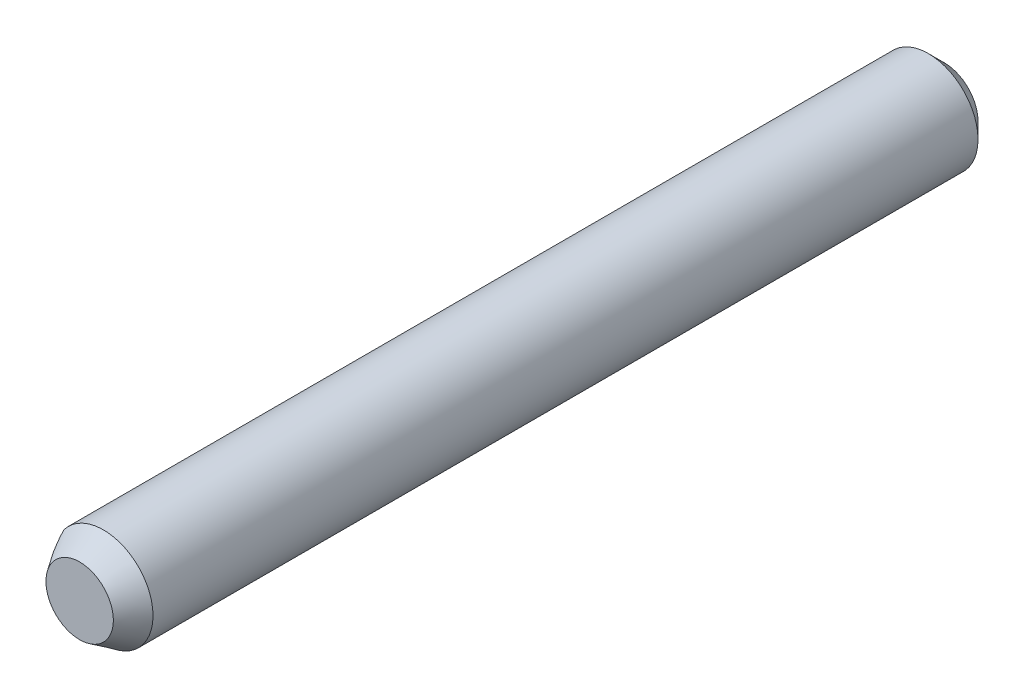
ISO-10303-21;
HEADER;
FILE_DESCRIPTION(('STEP AP214'),'2;1');
FILE_NAME('part.step','',(''),(''),'','','');
FILE_SCHEMA(('AUTOMOTIVE_DESIGN { 1 0 10303 214 1 1 1 1 }'));
ENDSEC;
DATA;
#1=APPLICATION_CONTEXT('core data for automotive mechanical design processes');
#2=APPLICATION_PROTOCOL_DEFINITION('international standard','automotive_design',2000,#1);
#3=PRODUCT_CONTEXT('',#1,'mechanical');
#4=PRODUCT('Part','Part','',(#3));
#5=PRODUCT_RELATED_PRODUCT_CATEGORY('part','',(#4));
#6=PRODUCT_DEFINITION_FORMATION('','',#4);
#7=PRODUCT_DEFINITION_CONTEXT('part definition',#1,'design');
#8=PRODUCT_DEFINITION('design','',#6,#7);
#9=PRODUCT_DEFINITION_SHAPE('','',#8);
#10=(LENGTH_UNIT() NAMED_UNIT(*) SI_UNIT(.MILLI.,.METRE.));
#11=(NAMED_UNIT(*) PLANE_ANGLE_UNIT() SI_UNIT($,.RADIAN.));
#12=(NAMED_UNIT(*) SI_UNIT($,.STERADIAN.) SOLID_ANGLE_UNIT());
#13=UNCERTAINTY_MEASURE_WITH_UNIT(LENGTH_MEASURE(1.E-05),#10,'distance_accuracy_value','');
#14=(GEOMETRIC_REPRESENTATION_CONTEXT(3) GLOBAL_UNCERTAINTY_ASSIGNED_CONTEXT((#13)) GLOBAL_UNIT_ASSIGNED_CONTEXT((#10,
#11,#12)) REPRESENTATION_CONTEXT('',''));
#15=CARTESIAN_POINT('',(0.,0.,0.));
#16=DIRECTION('',(0.,0.,1.));
#17=DIRECTION('',(1.,0.,0.));
#18=AXIS2_PLACEMENT_3D('',#15,#16,#17);
#19=CARTESIAN_POINT('',(0.,0.,43.6));
#20=DIRECTION('',(0.,0.,1.));
#21=DIRECTION('',(1.,0.,0.));
#22=AXIS2_PLACEMENT_3D('',#19,#20,#21);
#23=PLANE('',#22);
#24=CARTESIAN_POINT('',(0.,0.,43.6));
#25=DIRECTION('',(0.,0.,1.));
#26=DIRECTION('',(1.,0.,0.));
#27=AXIS2_PLACEMENT_3D('',#24,#25,#26);
#28=CIRCLE('',#27,1.7);
#29=CARTESIAN_POINT('',(1.7,0.,43.6));
#30=VERTEX_POINT('',#29);
#31=EDGE_CURVE('E39',#30,#30,#28,.T.);
#32=ORIENTED_EDGE('',*,*,#31,.T.);
#33=EDGE_LOOP('',(#32));
#34=FACE_BOUND('',#33,.T.);
#35=ADVANCED_FACE('F17',(#34),#23,.T.);
#36=CARTESIAN_POINT('',(0.,0.,0.));
#37=DIRECTION('',(0.,0.,1.));
#38=DIRECTION('',(1.,0.,0.));
#39=AXIS2_PLACEMENT_3D('',#36,#37,#38);
#40=PLANE('',#39);
#41=CARTESIAN_POINT('',(0.,0.,0.));
#42=DIRECTION('',(0.,0.,1.));
#43=DIRECTION('',(1.,0.,0.));
#44=AXIS2_PLACEMENT_3D('',#41,#42,#43);
#45=CIRCLE('',#44,1.7);
#46=CARTESIAN_POINT('',(1.7,0.,0.));
#47=VERTEX_POINT('',#46);
#48=EDGE_CURVE('E76',#47,#47,#45,.T.);
#49=ORIENTED_EDGE('',*,*,#48,.F.);
#50=EDGE_LOOP('',(#49));
#51=FACE_BOUND('',#50,.T.);
#52=ADVANCED_FACE('F19',(#51),#40,.F.);
#53=CARTESIAN_POINT('',(-2.8277485,0.,25.6));
#54=DIRECTION('',(0.,0.,1.));
#55=DIRECTION('',(1.,0.,0.));
#56=AXIS2_PLACEMENT_3D('',#53,#54,#55);
#57=PLANE('',#56);
#58=CARTESIAN_POINT('',(0.,0.,25.6));
#59=DIRECTION('',(0.,0.,-1.));
#60=DIRECTION('',(1.,0.,0.));
#61=AXIS2_PLACEMENT_3D('',#58,#59,#60);
#62=CIRCLE('',#61,2.5);
#63=CARTESIAN_POINT('',(-2.,-1.5,25.6));
#64=VERTEX_POINT('',#63);
#65=CARTESIAN_POINT('',(-2.,1.5,25.6));
#66=VERTEX_POINT('',#65);
#67=EDGE_CURVE('E104',#64,#66,#62,.T.);
#68=ORIENTED_EDGE('',*,*,#67,.F.);
#69=DIRECTION('',(0.,-1.,0.));
#70=VECTOR('',#69,1.);
#71=CARTESIAN_POINT('',(-2.,2.198144,25.6));
#72=LINE('',#71,#70);
#73=EDGE_CURVE('E11',#66,#64,#72,.T.);
#74=ORIENTED_EDGE('',*,*,#73,.F.);
#75=EDGE_LOOP('',(#68,#74));
#76=FACE_BOUND('',#75,.T.);
#77=ADVANCED_FACE('F199',(#76),#57,.T.);
#78=CARTESIAN_POINT('',(-2.,2.198144,43.6));
#79=DIRECTION('',(-1.,0.,0.));
#80=DIRECTION('',(0.,0.,1.));
#81=AXIS2_PLACEMENT_3D('',#78,#79,#80);
#82=PLANE('',#81);
#83=DIRECTION('',(0.,0.,-1.));
#84=VECTOR('',#83,1.);
#85=CARTESIAN_POINT('',(-2.,1.5,0.));
#86=LINE('',#85,#84);
#87=CARTESIAN_POINT('',(-2.,1.5,42.4));
#88=VERTEX_POINT('',#87);
#89=EDGE_CURVE('E107',#88,#66,#86,.T.);
#90=ORIENTED_EDGE('',*,*,#89,.T.);
#91=ORIENTED_EDGE('',*,*,#73,.T.);
#92=DIRECTION('',(0.,0.,-1.));
#93=VECTOR('',#92,1.);
#94=CARTESIAN_POINT('',(-2.,-1.5,0.));
#95=LINE('',#94,#93);
#96=CARTESIAN_POINT('',(-2.,-1.5,42.4));
#97=VERTEX_POINT('',#96);
#98=EDGE_CURVE('E97',#97,#64,#95,.T.);
#99=ORIENTED_EDGE('',*,*,#98,.F.);
#100=CARTESIAN_POINT('',(-2.,1.5,42.4));
#101=CARTESIAN_POINT('',(-2.,0.,43.75));
#102=CARTESIAN_POINT('',(-2.,-1.5,42.4));
#103=(BOUNDED_CURVE() B_SPLINE_CURVE(2,(#100,#101,#102),.UNSPECIFIED.,.F.,
.F.) B_SPLINE_CURVE_WITH_KNOTS((3,3),(0.,1.),
.UNSPECIFIED.) CURVE() GEOMETRIC_REPRESENTATION_ITEM() RATIONAL_B_SPLINE_CURVE((1.,1.25,1.)) REPRESENTATION_ITEM(''));
#104=EDGE_CURVE('E21',#88,#97,#103,.T.);
#105=ORIENTED_EDGE('',*,*,#104,.F.);
#106=EDGE_LOOP('',(#90,#91,#99,#105));
#107=FACE_BOUND('',#106,.T.);
#108=ADVANCED_FACE('F124',(#107),#82,.T.);
#109=CARTESIAN_POINT('',(0.,0.,42.4));
#110=DIRECTION('',(0.,0.,-1.));
#111=DIRECTION('',(1.,0.,0.));
#112=AXIS2_PLACEMENT_3D('',#109,#110,#111);
#113=CONICAL_SURFACE('',#112,2.5,0.588002603548);
#114=CARTESIAN_POINT('',(0.,0.,42.4));
#115=DIRECTION('',(0.,0.,1.));
#116=DIRECTION('',(1.,0.,0.));
#117=AXIS2_PLACEMENT_3D('',#114,#115,#116);
#118=CIRCLE('',#117,2.5);
#119=CARTESIAN_POINT('',(2.5,0.,42.4));
#120=VERTEX_POINT('',#119);
#121=EDGE_CURVE('E90',#97,#120,#118,.T.);
#122=ORIENTED_EDGE('',*,*,#121,.T.);
#123=DIRECTION('',(-0.554700196224998,0.,0.832050294337998));
#124=VECTOR('',#123,1.);
#125=CARTESIAN_POINT('',(2.5,0.,42.4));
#126=LINE('',#125,#124);
#127=EDGE_CURVE('E78',#120,#30,#126,.T.);
#128=ORIENTED_EDGE('',*,*,#127,.T.);
#129=ORIENTED_EDGE('',*,*,#31,.F.);
#130=ORIENTED_EDGE('',*,*,#127,.F.);
#131=CARTESIAN_POINT('',(0.,0.,42.4));
#132=DIRECTION('',(0.,0.,1.));
#133=DIRECTION('',(1.,0.,0.));
#134=AXIS2_PLACEMENT_3D('',#131,#132,#133);
#135=CIRCLE('',#134,2.5);
#136=EDGE_CURVE('E86',#120,#88,#135,.T.);
#137=ORIENTED_EDGE('',*,*,#136,.T.);
#138=ORIENTED_EDGE('',*,*,#104,.T.);
#139=EDGE_LOOP('',(#122,#128,#129,#130,#137,#138));
#140=FACE_BOUND('',#139,.T.);
#141=ADVANCED_FACE('F118',(#140),#113,.T.);
#142=CARTESIAN_POINT('',(0.,0.,0.8));
#143=DIRECTION('',(0.,0.,1.));
#144=DIRECTION('',(1.,0.,0.));
#145=AXIS2_PLACEMENT_3D('',#142,#143,#144);
#146=CONICAL_SURFACE('',#145,2.5,0.785398163397);
#147=ORIENTED_EDGE('',*,*,#48,.T.);
#148=DIRECTION('',(-0.707106781186548,0.,-0.707106781186548));
#149=VECTOR('',#148,1.);
#150=CARTESIAN_POINT('',(2.5,0.,0.8));
#151=LINE('',#150,#149);
#152=CARTESIAN_POINT('',(2.5,0.,0.8));
#153=VERTEX_POINT('',#152);
#154=EDGE_CURVE('E48',#153,#47,#151,.T.);
#155=ORIENTED_EDGE('',*,*,#154,.F.);
#156=CARTESIAN_POINT('',(0.,0.,0.8));
#157=DIRECTION('',(0.,0.,1.));
#158=DIRECTION('',(1.,0.,0.));
#159=AXIS2_PLACEMENT_3D('',#156,#157,#158);
#160=CIRCLE('',#159,2.5);
#161=EDGE_CURVE('E74',#153,#153,#160,.T.);
#162=ORIENTED_EDGE('',*,*,#161,.F.);
#163=ORIENTED_EDGE('',*,*,#154,.T.);
#164=EDGE_LOOP('',(#147,#155,#162,#163));
#165=FACE_BOUND('',#164,.T.);
#166=ADVANCED_FACE('F72',(#165),#146,.T.);
#167=CARTESIAN_POINT('',(0.,0.,0.));
#168=DIRECTION('',(0.,0.,-1.));
#169=DIRECTION('',(1.,0.,0.));
#170=AXIS2_PLACEMENT_3D('',#167,#168,#169);
#171=CYLINDRICAL_SURFACE('',#170,2.5);
#172=ORIENTED_EDGE('',*,*,#161,.T.);
#173=DIRECTION('',(0.,0.,1.));
#174=VECTOR('',#173,1.);
#175=CARTESIAN_POINT('',(2.5,0.,0.));
#176=LINE('',#175,#174);
#177=EDGE_CURVE('E82',#153,#120,#176,.T.);
#178=ORIENTED_EDGE('',*,*,#177,.T.);
#179=ORIENTED_EDGE('',*,*,#121,.F.);
#180=ORIENTED_EDGE('',*,*,#98,.T.);
#181=ORIENTED_EDGE('',*,*,#67,.T.);
#182=ORIENTED_EDGE('',*,*,#89,.F.);
#183=ORIENTED_EDGE('',*,*,#136,.F.);
#184=ORIENTED_EDGE('',*,*,#177,.F.);
#185=EDGE_LOOP('',(#172,#178,#179,#180,#181,#182,#183,#184));
#186=FACE_BOUND('',#185,.T.);
#187=ADVANCED_FACE('F83',(#186),#171,.T.);
#188=CLOSED_SHELL('',(#35,#52,#77,#108,#141,#166,#187));
#189=MANIFOLD_SOLID_BREP('B1',#188);
#190=ADVANCED_BREP_SHAPE_REPRESENTATION('',(#18,#189),#14);
#191=SHAPE_DEFINITION_REPRESENTATION(#9,#190);
ENDSEC;
END-ISO-10303-21;
